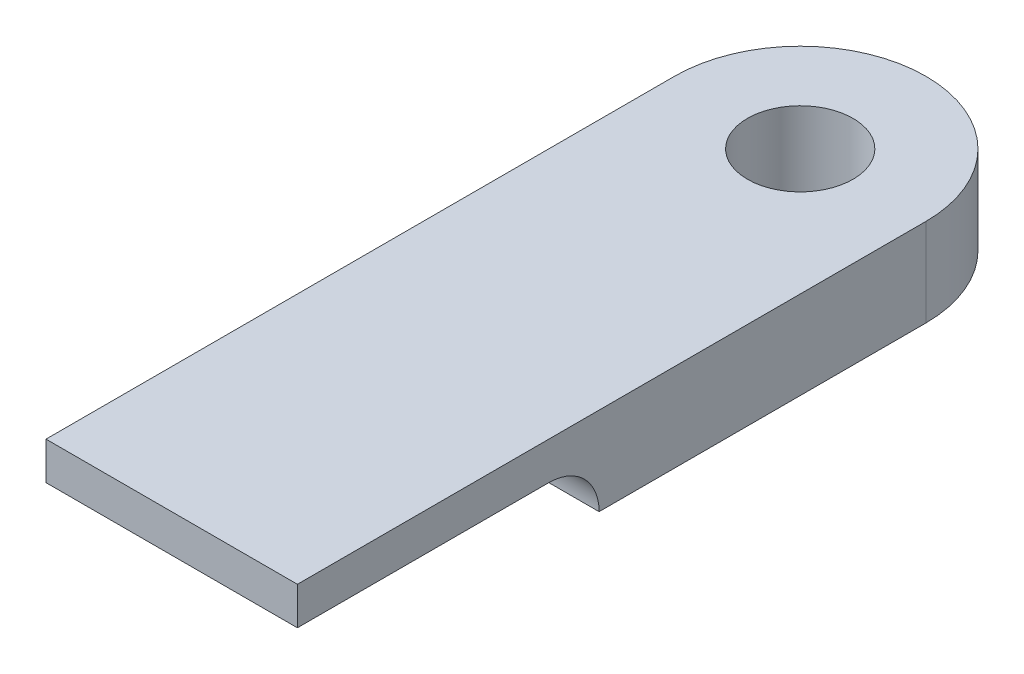
ISO-10303-21;
HEADER;
FILE_DESCRIPTION(('STEP AP214'),'2;1');
FILE_NAME('part.step','',(''),(''),'','','');
FILE_SCHEMA(('AUTOMOTIVE_DESIGN { 1 0 10303 214 1 1 1 1 }'));
ENDSEC;
DATA;
#1=APPLICATION_CONTEXT('core data for automotive mechanical design processes');
#2=APPLICATION_PROTOCOL_DEFINITION('international standard','automotive_design',2000,#1);
#3=PRODUCT_CONTEXT('',#1,'mechanical');
#4=PRODUCT('Part','Part','',(#3));
#5=PRODUCT_RELATED_PRODUCT_CATEGORY('part','',(#4));
#6=PRODUCT_DEFINITION_FORMATION('','',#4);
#7=PRODUCT_DEFINITION_CONTEXT('part definition',#1,'design');
#8=PRODUCT_DEFINITION('design','',#6,#7);
#9=PRODUCT_DEFINITION_SHAPE('','',#8);
#10=(LENGTH_UNIT() NAMED_UNIT(*) SI_UNIT(.MILLI.,.METRE.));
#11=(NAMED_UNIT(*) PLANE_ANGLE_UNIT() SI_UNIT($,.RADIAN.));
#12=(NAMED_UNIT(*) SI_UNIT($,.STERADIAN.) SOLID_ANGLE_UNIT());
#13=UNCERTAINTY_MEASURE_WITH_UNIT(LENGTH_MEASURE(1.E-05),#10,'distance_accuracy_value','');
#14=(GEOMETRIC_REPRESENTATION_CONTEXT(3) GLOBAL_UNCERTAINTY_ASSIGNED_CONTEXT((#13)) GLOBAL_UNIT_ASSIGNED_CONTEXT((#10,
#11,#12)) REPRESENTATION_CONTEXT('',''));
#15=CARTESIAN_POINT('',(0.,0.,0.));
#16=DIRECTION('',(0.,0.,1.));
#17=DIRECTION('',(1.,0.,0.));
#18=AXIS2_PLACEMENT_3D('',#15,#16,#17);
#19=CARTESIAN_POINT('',(-5.,1.75,15.));
#20=DIRECTION('',(1.,0.,0.));
#21=DIRECTION('',(0.,0.,-1.));
#22=AXIS2_PLACEMENT_3D('',#19,#20,#21);
#23=PLANE('',#22);
#24=DIRECTION('',(0.,0.,-1.));
#25=VECTOR('',#24,1.);
#26=CARTESIAN_POINT('',(-5.,0.25,15.));
#27=LINE('',#26,#25);
#28=CARTESIAN_POINT('',(-5.,0.25,15.));
#29=VERTEX_POINT('',#28);
#30=CARTESIAN_POINT('',(-5.,0.25,5.));
#31=VERTEX_POINT('',#30);
#32=EDGE_CURVE('E115',#29,#31,#27,.T.);
#33=ORIENTED_EDGE('',*,*,#32,.F.);
#34=DIRECTION('',(0.,-1.,0.));
#35=VECTOR('',#34,1.);
#36=CARTESIAN_POINT('',(-5.,1.75,15.));
#37=LINE('',#36,#35);
#38=CARTESIAN_POINT('',(-5.,1.75,15.));
#39=VERTEX_POINT('',#38);
#40=EDGE_CURVE('E122',#39,#29,#37,.T.);
#41=ORIENTED_EDGE('',*,*,#40,.F.);
#42=DIRECTION('',(0.,0.,1.));
#43=VECTOR('',#42,1.);
#44=CARTESIAN_POINT('',(-5.,1.75,15.));
#45=LINE('',#44,#43);
#46=CARTESIAN_POINT('',(-5.,1.75,-10.));
#47=VERTEX_POINT('',#46);
#48=EDGE_CURVE('E176',#47,#39,#45,.T.);
#49=ORIENTED_EDGE('',*,*,#48,.F.);
#50=DIRECTION('',(0.,-1.,0.));
#51=VECTOR('',#50,1.);
#52=CARTESIAN_POINT('',(-5.,1.75,-10.));
#53=LINE('',#52,#51);
#54=CARTESIAN_POINT('',(-5.,-1.75,-10.));
#55=VERTEX_POINT('',#54);
#56=EDGE_CURVE('E160',#47,#55,#53,.T.);
#57=ORIENTED_EDGE('',*,*,#56,.T.);
#58=DIRECTION('',(0.,0.,1.));
#59=VECTOR('',#58,1.);
#60=CARTESIAN_POINT('',(-5.,-1.75,15.));
#61=LINE('',#60,#59);
#62=CARTESIAN_POINT('',(-5.,-1.75,3.));
#63=VERTEX_POINT('',#62);
#64=EDGE_CURVE('E163',#55,#63,#61,.T.);
#65=ORIENTED_EDGE('',*,*,#64,.T.);
#66=CARTESIAN_POINT('',(-5.,-1.75,5.));
#67=DIRECTION('',(1.,0.,0.));
#68=DIRECTION('',(0.,0.,-1.));
#69=AXIS2_PLACEMENT_3D('',#66,#67,#68);
#70=CIRCLE('',#69,2.);
#71=EDGE_CURVE('E11',#63,#31,#70,.T.);
#72=ORIENTED_EDGE('',*,*,#71,.T.);
#73=EDGE_LOOP('',(#33,#41,#49,#57,#65,#72));
#74=FACE_BOUND('',#73,.T.);
#75=ADVANCED_FACE('F44',(#74),#23,.F.);
#76=CARTESIAN_POINT('',(5.,1.75,15.));
#77=DIRECTION('',(0.,0.,-1.));
#78=DIRECTION('',(-1.,0.,0.));
#79=AXIS2_PLACEMENT_3D('',#76,#77,#78);
#80=PLANE('',#79);
#81=DIRECTION('',(-1.,0.,0.));
#82=VECTOR('',#81,1.);
#83=CARTESIAN_POINT('',(-5.,0.25,15.));
#84=LINE('',#83,#82);
#85=CARTESIAN_POINT('',(5.,0.25,15.));
#86=VERTEX_POINT('',#85);
#87=EDGE_CURVE('E110',#86,#29,#84,.T.);
#88=ORIENTED_EDGE('',*,*,#87,.F.);
#89=DIRECTION('',(0.,-1.,0.));
#90=VECTOR('',#89,1.);
#91=CARTESIAN_POINT('',(5.,1.75,15.));
#92=LINE('',#91,#90);
#93=CARTESIAN_POINT('',(5.,1.75,15.));
#94=VERTEX_POINT('',#93);
#95=EDGE_CURVE('E116',#94,#86,#92,.T.);
#96=ORIENTED_EDGE('',*,*,#95,.F.);
#97=DIRECTION('',(1.,0.,0.));
#98=VECTOR('',#97,1.);
#99=CARTESIAN_POINT('',(5.,1.75,15.));
#100=LINE('',#99,#98);
#101=EDGE_CURVE('E136',#39,#94,#100,.T.);
#102=ORIENTED_EDGE('',*,*,#101,.F.);
#103=ORIENTED_EDGE('',*,*,#40,.T.);
#104=EDGE_LOOP('',(#88,#96,#102,#103));
#105=FACE_BOUND('',#104,.T.);
#106=ADVANCED_FACE('F119',(#105),#80,.F.);
#107=CARTESIAN_POINT('',(0.,-1.75,0.));
#108=DIRECTION('',(0.,1.,0.));
#109=DIRECTION('',(0.,0.,1.));
#110=AXIS2_PLACEMENT_3D('',#107,#108,#109);
#111=PLANE('',#110);
#112=CARTESIAN_POINT('',(0.,-1.75,-10.));
#113=DIRECTION('',(0.,1.,0.));
#114=DIRECTION('',(0.,0.,1.));
#115=AXIS2_PLACEMENT_3D('',#112,#113,#114);
#116=CIRCLE('',#115,2.1);
#117=CARTESIAN_POINT('',(0.,-1.75,-7.9));
#118=VERTEX_POINT('',#117);
#119=EDGE_CURVE('E164',#118,#118,#116,.T.);
#120=ORIENTED_EDGE('',*,*,#119,.T.);
#121=EDGE_LOOP('',(#120));
#122=FACE_BOUND('',#121,.T.);
#123=DIRECTION('',(1.,0.,0.));
#124=VECTOR('',#123,1.);
#125=CARTESIAN_POINT('',(-5.,-1.75,3.));
#126=LINE('',#125,#124);
#127=CARTESIAN_POINT('',(5.,-1.75,3.));
#128=VERTEX_POINT('',#127);
#129=EDGE_CURVE('E174',#63,#128,#126,.T.);
#130=ORIENTED_EDGE('',*,*,#129,.F.);
#131=ORIENTED_EDGE('',*,*,#64,.F.);
#132=CARTESIAN_POINT('',(0.,-1.75,-10.));
#133=DIRECTION('',(0.,1.,0.));
#134=DIRECTION('',(0.,0.,1.));
#135=AXIS2_PLACEMENT_3D('',#132,#133,#134);
#136=CIRCLE('',#135,5.);
#137=CARTESIAN_POINT('',(0.,-1.75,-15.));
#138=VERTEX_POINT('',#137);
#139=EDGE_CURVE('E131',#55,#138,#136,.F.);
#140=ORIENTED_EDGE('',*,*,#139,.T.);
#141=CARTESIAN_POINT('',(0.,-1.75,-10.));
#142=DIRECTION('',(0.,1.,0.));
#143=DIRECTION('',(0.,0.,1.));
#144=AXIS2_PLACEMENT_3D('',#141,#142,#143);
#145=CIRCLE('',#144,5.);
#146=CARTESIAN_POINT('',(5.,-1.75,-10.));
#147=VERTEX_POINT('',#146);
#148=EDGE_CURVE('E145',#138,#147,#145,.F.);
#149=ORIENTED_EDGE('',*,*,#148,.T.);
#150=DIRECTION('',(0.,0.,-1.));
#151=VECTOR('',#150,1.);
#152=CARTESIAN_POINT('',(5.,-1.75,15.));
#153=LINE('',#152,#151);
#154=EDGE_CURVE('E138',#128,#147,#153,.T.);
#155=ORIENTED_EDGE('',*,*,#154,.F.);
#156=EDGE_LOOP('',(#130,#131,#140,#149,#155));
#157=FACE_BOUND('',#156,.T.);
#158=ADVANCED_FACE('F168',(#122,#157),#111,.F.);
#159=CARTESIAN_POINT('',(5.,1.75,15.));
#160=DIRECTION('',(-1.,0.,0.));
#161=DIRECTION('',(0.,0.,1.));
#162=AXIS2_PLACEMENT_3D('',#159,#160,#161);
#163=PLANE('',#162);
#164=DIRECTION('',(0.,0.,1.));
#165=VECTOR('',#164,1.);
#166=CARTESIAN_POINT('',(5.,0.25,15.));
#167=LINE('',#166,#165);
#168=CARTESIAN_POINT('',(5.,0.25,5.));
#169=VERTEX_POINT('',#168);
#170=EDGE_CURVE('E102',#169,#86,#167,.T.);
#171=ORIENTED_EDGE('',*,*,#170,.F.);
#172=CARTESIAN_POINT('',(5.,-1.75,5.));
#173=DIRECTION('',(-1.,0.,0.));
#174=DIRECTION('',(0.,0.,1.));
#175=AXIS2_PLACEMENT_3D('',#172,#173,#174);
#176=CIRCLE('',#175,2.);
#177=EDGE_CURVE('E53',#169,#128,#176,.T.);
#178=ORIENTED_EDGE('',*,*,#177,.T.);
#179=ORIENTED_EDGE('',*,*,#154,.T.);
#180=DIRECTION('',(0.,-1.,0.));
#181=VECTOR('',#180,1.);
#182=CARTESIAN_POINT('',(5.,1.75,-10.));
#183=LINE('',#182,#181);
#184=CARTESIAN_POINT('',(5.,1.75,-10.));
#185=VERTEX_POINT('',#184);
#186=EDGE_CURVE('E146',#147,#185,#183,.F.);
#187=ORIENTED_EDGE('',*,*,#186,.T.);
#188=DIRECTION('',(0.,0.,-1.));
#189=VECTOR('',#188,1.);
#190=CARTESIAN_POINT('',(5.,1.75,15.));
#191=LINE('',#190,#189);
#192=EDGE_CURVE('E129',#94,#185,#191,.T.);
#193=ORIENTED_EDGE('',*,*,#192,.F.);
#194=ORIENTED_EDGE('',*,*,#95,.T.);
#195=EDGE_LOOP('',(#171,#178,#179,#187,#193,#194));
#196=FACE_BOUND('',#195,.T.);
#197=ADVANCED_FACE('F127',(#196),#163,.F.);
#198=CARTESIAN_POINT('',(0.,1.75,0.));
#199=DIRECTION('',(0.,1.,0.));
#200=DIRECTION('',(0.,0.,1.));
#201=AXIS2_PLACEMENT_3D('',#198,#199,#200);
#202=PLANE('',#201);
#203=CARTESIAN_POINT('',(0.,1.75,-10.));
#204=DIRECTION('',(0.,1.,0.));
#205=DIRECTION('',(0.,0.,1.));
#206=AXIS2_PLACEMENT_3D('',#203,#204,#205);
#207=CIRCLE('',#206,2.1);
#208=CARTESIAN_POINT('',(0.,1.75,-7.9));
#209=VERTEX_POINT('',#208);
#210=EDGE_CURVE('E123',#209,#209,#207,.T.);
#211=ORIENTED_EDGE('',*,*,#210,.F.);
#212=EDGE_LOOP('',(#211));
#213=FACE_BOUND('',#212,.T.);
#214=ORIENTED_EDGE('',*,*,#192,.T.);
#215=CARTESIAN_POINT('',(0.,1.75,-10.));
#216=DIRECTION('',(0.,1.,0.));
#217=DIRECTION('',(0.,0.,1.));
#218=AXIS2_PLACEMENT_3D('',#215,#216,#217);
#219=CIRCLE('',#218,5.);
#220=CARTESIAN_POINT('',(0.,1.75,-15.));
#221=VERTEX_POINT('',#220);
#222=EDGE_CURVE('E152',#185,#221,#219,.T.);
#223=ORIENTED_EDGE('',*,*,#222,.T.);
#224=CARTESIAN_POINT('',(0.,1.75,-10.));
#225=DIRECTION('',(0.,1.,0.));
#226=DIRECTION('',(0.,0.,1.));
#227=AXIS2_PLACEMENT_3D('',#224,#225,#226);
#228=CIRCLE('',#227,5.);
#229=EDGE_CURVE('E151',#221,#47,#228,.T.);
#230=ORIENTED_EDGE('',*,*,#229,.T.);
#231=ORIENTED_EDGE('',*,*,#48,.T.);
#232=ORIENTED_EDGE('',*,*,#101,.T.);
#233=EDGE_LOOP('',(#214,#223,#230,#231,#232));
#234=FACE_BOUND('',#233,.T.);
#235=ADVANCED_FACE('F205',(#213,#234),#202,.T.);
#236=CARTESIAN_POINT('',(0.,1.75,-10.));
#237=DIRECTION('',(0.,-1.,0.));
#238=DIRECTION('',(0.,0.,-1.));
#239=AXIS2_PLACEMENT_3D('',#236,#237,#238);
#240=CYLINDRICAL_SURFACE('',#239,5.);
#241=ORIENTED_EDGE('',*,*,#56,.F.);
#242=ORIENTED_EDGE('',*,*,#229,.F.);
#243=DIRECTION('',(0.,-1.,0.));
#244=VECTOR('',#243,1.);
#245=CARTESIAN_POINT('',(0.,1.75,-15.));
#246=LINE('',#245,#244);
#247=EDGE_CURVE('E159',#138,#221,#246,.F.);
#248=ORIENTED_EDGE('',*,*,#247,.F.);
#249=ORIENTED_EDGE('',*,*,#139,.F.);
#250=EDGE_LOOP('',(#241,#242,#248,#249));
#251=FACE_BOUND('',#250,.T.);
#252=ADVANCED_FACE('F197',(#251),#240,.T.);
#253=CARTESIAN_POINT('',(0.,1.75,-10.));
#254=DIRECTION('',(0.,-1.,0.));
#255=DIRECTION('',(0.,0.,-1.));
#256=AXIS2_PLACEMENT_3D('',#253,#254,#255);
#257=CYLINDRICAL_SURFACE('',#256,5.);
#258=ORIENTED_EDGE('',*,*,#222,.F.);
#259=ORIENTED_EDGE('',*,*,#186,.F.);
#260=ORIENTED_EDGE('',*,*,#148,.F.);
#261=ORIENTED_EDGE('',*,*,#247,.T.);
#262=EDGE_LOOP('',(#258,#259,#260,#261));
#263=FACE_BOUND('',#262,.T.);
#264=ADVANCED_FACE('F199',(#263),#257,.T.);
#265=CARTESIAN_POINT('',(0.,-1.75,-10.));
#266=DIRECTION('',(0.,1.,0.));
#267=DIRECTION('',(0.,0.,1.));
#268=AXIS2_PLACEMENT_3D('',#265,#266,#267);
#269=CYLINDRICAL_SURFACE('',#268,2.1);
#270=ORIENTED_EDGE('',*,*,#119,.F.);
#271=EDGE_LOOP('',(#270));
#272=FACE_BOUND('',#271,.T.);
#273=ORIENTED_EDGE('',*,*,#210,.T.);
#274=EDGE_LOOP('',(#273));
#275=FACE_BOUND('',#274,.T.);
#276=ADVANCED_FACE('F221',(#272,#275),#269,.F.);
#277=CARTESIAN_POINT('',(0.,0.25,0.));
#278=DIRECTION('',(0.,-1.,0.));
#279=DIRECTION('',(0.,0.,-1.));
#280=AXIS2_PLACEMENT_3D('',#277,#278,#279);
#281=PLANE('',#280);
#282=ORIENTED_EDGE('',*,*,#32,.T.);
#283=DIRECTION('',(1.,0.,0.));
#284=VECTOR('',#283,1.);
#285=CARTESIAN_POINT('',(0.,0.25,5.));
#286=LINE('',#285,#284);
#287=EDGE_CURVE('E107',#31,#169,#286,.T.);
#288=ORIENTED_EDGE('',*,*,#287,.T.);
#289=ORIENTED_EDGE('',*,*,#170,.T.);
#290=ORIENTED_EDGE('',*,*,#87,.T.);
#291=EDGE_LOOP('',(#282,#288,#289,#290));
#292=FACE_BOUND('',#291,.T.);
#293=ADVANCED_FACE('F106',(#292),#281,.T.);
#294=CARTESIAN_POINT('',(0.,-1.75,5.));
#295=DIRECTION('',(1.,0.,0.));
#296=DIRECTION('',(0.,0.,-1.));
#297=AXIS2_PLACEMENT_3D('',#294,#295,#296);
#298=CYLINDRICAL_SURFACE('',#297,2.);
#299=ORIENTED_EDGE('',*,*,#71,.F.);
#300=ORIENTED_EDGE('',*,*,#129,.T.);
#301=ORIENTED_EDGE('',*,*,#177,.F.);
#302=ORIENTED_EDGE('',*,*,#287,.F.);
#303=EDGE_LOOP('',(#299,#300,#301,#302));
#304=FACE_BOUND('',#303,.T.);
#305=ADVANCED_FACE('F50',(#304),#298,.F.);
#306=CLOSED_SHELL('',(#75,#106,#158,#197,#235,#252,#264,#276,#293,#305));
#307=MANIFOLD_SOLID_BREP('B2',#306);
#308=ADVANCED_BREP_SHAPE_REPRESENTATION('',(#18,#307),#14);
#309=SHAPE_DEFINITION_REPRESENTATION(#9,#308);
ENDSEC;
END-ISO-10303-21;
